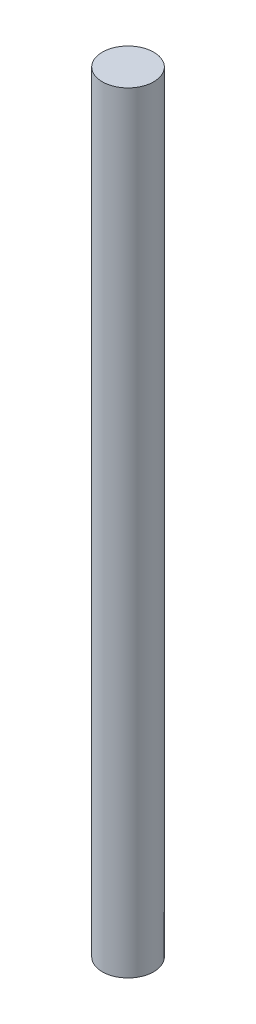
ISO-10303-21;
HEADER;
FILE_DESCRIPTION(('STEP AP214'),'2;1');
FILE_NAME('part.step','',(''),(''),'','','');
FILE_SCHEMA(('AUTOMOTIVE_DESIGN { 1 0 10303 214 1 1 1 1 }'));
ENDSEC;
DATA;
#1=APPLICATION_CONTEXT('core data for automotive mechanical design processes');
#2=APPLICATION_PROTOCOL_DEFINITION('international standard','automotive_design',2000,#1);
#3=PRODUCT_CONTEXT('',#1,'mechanical');
#4=PRODUCT('Part','Part','',(#3));
#5=PRODUCT_RELATED_PRODUCT_CATEGORY('part','',(#4));
#6=PRODUCT_DEFINITION_FORMATION('','',#4);
#7=PRODUCT_DEFINITION_CONTEXT('part definition',#1,'design');
#8=PRODUCT_DEFINITION('design','',#6,#7);
#9=PRODUCT_DEFINITION_SHAPE('','',#8);
#10=(LENGTH_UNIT() NAMED_UNIT(*) SI_UNIT(.MILLI.,.METRE.));
#11=(NAMED_UNIT(*) PLANE_ANGLE_UNIT() SI_UNIT($,.RADIAN.));
#12=(NAMED_UNIT(*) SI_UNIT($,.STERADIAN.) SOLID_ANGLE_UNIT());
#13=UNCERTAINTY_MEASURE_WITH_UNIT(LENGTH_MEASURE(1.E-05),#10,'distance_accuracy_value','');
#14=(GEOMETRIC_REPRESENTATION_CONTEXT(3) GLOBAL_UNCERTAINTY_ASSIGNED_CONTEXT((#13)) GLOBAL_UNIT_ASSIGNED_CONTEXT((#10,
#11,#12)) REPRESENTATION_CONTEXT('',''));
#15=CARTESIAN_POINT('',(0.,0.,0.));
#16=DIRECTION('',(0.,0.,1.));
#17=DIRECTION('',(1.,0.,0.));
#18=AXIS2_PLACEMENT_3D('',#15,#16,#17);
#19=CARTESIAN_POINT('',(0.,22.5,0.));
#20=DIRECTION('',(0.,-1.,0.));
#21=DIRECTION('',(0.,0.,-1.));
#22=AXIS2_PLACEMENT_3D('',#19,#20,#21);
#23=CYLINDRICAL_SURFACE('',#22,1.5);
#24=CARTESIAN_POINT('',(0.,22.5,0.));
#25=DIRECTION('',(0.,1.,0.));
#26=DIRECTION('',(0.,0.,1.));
#27=AXIS2_PLACEMENT_3D('',#24,#25,#26);
#28=CIRCLE('',#27,1.5);
#29=CARTESIAN_POINT('',(0.,22.5,-1.5));
#30=VERTEX_POINT('',#29);
#31=EDGE_CURVE('E10',#30,#30,#28,.T.);
#32=CARTESIAN_POINT('',(0.,-22.5,0.));
#33=DIRECTION('',(0.,1.,0.));
#34=DIRECTION('',(0.,0.,1.));
#35=AXIS2_PLACEMENT_3D('',#32,#33,#34);
#36=CIRCLE('',#35,1.5);
#37=CARTESIAN_POINT('',(0.,-22.5,-1.5));
#38=VERTEX_POINT('',#37);
#39=EDGE_CURVE('E33',#38,#38,#36,.T.);
#40=CARTESIAN_POINT('',(0.,22.5,-1.5));
#41=CARTESIAN_POINT('',(0.,22.03125,-1.5));
#42=CARTESIAN_POINT('',(0.,21.5625,-1.5));
#43=CARTESIAN_POINT('',(0.,20.625,-1.5));
#44=CARTESIAN_POINT('',(0.,20.15625,-1.5));
#45=CARTESIAN_POINT('',(0.,19.21875,-1.5));
#46=CARTESIAN_POINT('',(0.,18.75,-1.5));
#47=CARTESIAN_POINT('',(0.,17.8125,-1.5));
#48=CARTESIAN_POINT('',(0.,17.34375,-1.5));
#49=CARTESIAN_POINT('',(0.,16.40625,-1.5));
#50=CARTESIAN_POINT('',(0.,15.9375,-1.5));
#51=CARTESIAN_POINT('',(0.,15.,-1.5));
#52=CARTESIAN_POINT('',(0.,14.53125,-1.5));
#53=CARTESIAN_POINT('',(0.,13.59375,-1.5));
#54=CARTESIAN_POINT('',(0.,13.125,-1.5));
#55=CARTESIAN_POINT('',(0.,12.1875,-1.5));
#56=CARTESIAN_POINT('',(0.,11.71875,-1.5));
#57=CARTESIAN_POINT('',(0.,10.78125,-1.5));
#58=CARTESIAN_POINT('',(0.,10.3125,-1.5));
#59=CARTESIAN_POINT('',(0.,9.37499999999999,-1.5));
#60=CARTESIAN_POINT('',(0.,8.90625,-1.5));
#61=CARTESIAN_POINT('',(0.,7.96874999999999,-1.5));
#62=CARTESIAN_POINT('',(0.,7.5,-1.5));
#63=CARTESIAN_POINT('',(0.,6.5625,-1.5));
#64=CARTESIAN_POINT('',(0.,6.09374999999999,-1.5));
#65=CARTESIAN_POINT('',(0.,5.15624999999999,-1.5));
#66=CARTESIAN_POINT('',(0.,4.68749999999999,-1.5));
#67=CARTESIAN_POINT('',(0.,3.74999999999999,-1.5));
#68=CARTESIAN_POINT('',(0.,3.28124999999999,-1.5));
#69=CARTESIAN_POINT('',(0.,2.34375,-1.5));
#70=CARTESIAN_POINT('',(0.,1.87499999999999,-1.5));
#71=CARTESIAN_POINT('',(0.,0.937499999999994,-1.5));
#72=CARTESIAN_POINT('',(0.,0.468749999999993,-1.5));
#73=CARTESIAN_POINT('',(0.,-0.468750000000007,-1.5));
#74=CARTESIAN_POINT('',(0.,-0.937500000000008,-1.5));
#75=CARTESIAN_POINT('',(0.,-1.87500000000001,-1.5));
#76=CARTESIAN_POINT('',(0.,-2.34375000000001,-1.5));
#77=CARTESIAN_POINT('',(0.,-3.28125000000001,-1.5));
#78=CARTESIAN_POINT('',(0.,-3.75000000000001,-1.5));
#79=CARTESIAN_POINT('',(0.,-4.68750000000001,-1.5));
#80=CARTESIAN_POINT('',(0.,-5.15625000000001,-1.5));
#81=CARTESIAN_POINT('',(0.,-6.09375000000001,-1.5));
#82=CARTESIAN_POINT('',(0.,-6.56250000000001,-1.5));
#83=CARTESIAN_POINT('',(0.,-7.50000000000001,-1.5));
#84=CARTESIAN_POINT('',(0.,-7.96875000000001,-1.5));
#85=CARTESIAN_POINT('',(0.,-8.90625000000001,-1.5));
#86=CARTESIAN_POINT('',(0.,-9.37500000000001,-1.5));
#87=CARTESIAN_POINT('',(0.,-10.3125,-1.5));
#88=CARTESIAN_POINT('',(0.,-10.78125,-1.5));
#89=CARTESIAN_POINT('',(0.,-11.71875,-1.5));
#90=CARTESIAN_POINT('',(0.,-12.1875,-1.5));
#91=CARTESIAN_POINT('',(0.,-13.125,-1.5));
#92=CARTESIAN_POINT('',(0.,-13.59375,-1.5));
#93=CARTESIAN_POINT('',(0.,-14.53125,-1.5));
#94=CARTESIAN_POINT('',(0.,-15.,-1.5));
#95=CARTESIAN_POINT('',(0.,-15.9375,-1.5));
#96=CARTESIAN_POINT('',(0.,-16.40625,-1.5));
#97=CARTESIAN_POINT('',(0.,-17.34375,-1.5));
#98=CARTESIAN_POINT('',(0.,-17.8125,-1.5));
#99=CARTESIAN_POINT('',(0.,-18.75,-1.5));
#100=CARTESIAN_POINT('',(0.,-19.21875,-1.5));
#101=CARTESIAN_POINT('',(0.,-20.15625,-1.5));
#102=CARTESIAN_POINT('',(0.,-20.625,-1.5));
#103=CARTESIAN_POINT('',(0.,-21.5625,-1.5));
#104=CARTESIAN_POINT('',(0.,-22.03125,-1.5));
#105=CARTESIAN_POINT('',(0.,-22.5,-1.5));
#106=B_SPLINE_CURVE_WITH_KNOTS('',3,(#40,#41,#42,#43,#44,#45,#46,#47,#48,#49,#50,#51,#52,#53,
#54,#55,#56,#57,#58,#59,#60,#61,#62,#63,#64,#65,#66,#67,#68,#69,#70,#71,#72,#73,#74,#75,#76,#77,
#78,#79,#80,#81,#82,#83,#84,#85,#86,#87,#88,#89,#90,#91,#92,#93,#94,#95,#96,#97,#98,#99,#100,
#101,#102,#103,#104,#105),.UNSPECIFIED.,.F.,.F.,(4,2,2,2,2,2,2,2,2,2,2,2,2,2,2,2,2,2,2,2,2,2,2,
2,2,2,2,2,2,2,2,2,4),(0.,1.40625,2.8125,4.21875,5.625,7.03125,8.4375,9.84375,11.25,12.65625,
14.0625,15.46875,16.875,18.28125,19.6875,21.09375,22.5,23.90625,25.3125,26.71875,28.125,
29.53125,30.9375,32.34375,33.75,35.15625,36.5625,37.96875,39.375,40.78125,42.1875,43.59375,45.),.UNSPECIFIED.);
#107=EDGE_CURVE('BSEAM30',#30,#38,#106,.T.);
#108=ORIENTED_EDGE('',*,*,#31,.F.);
#109=ORIENTED_EDGE('',*,*,#39,.T.);
#110=ORIENTED_EDGE('',*,*,#107,.T.);
#111=ORIENTED_EDGE('',*,*,#107,.F.);
#112=EDGE_LOOP('',(#108,#110,#109,#111));
#113=FACE_BOUND('',#112,.T.);
#114=ADVANCED_FACE('F30',(#113),#23,.T.);
#115=CARTESIAN_POINT('',(0.,22.5,0.));
#116=DIRECTION('',(0.,1.,0.));
#117=DIRECTION('',(0.,0.,1.));
#118=AXIS2_PLACEMENT_3D('',#115,#116,#117);
#119=PLANE('',#118);
#120=ORIENTED_EDGE('',*,*,#31,.T.);
#121=EDGE_LOOP('',(#120));
#122=FACE_BOUND('',#121,.T.);
#123=ADVANCED_FACE('F45',(#122),#119,.T.);
#124=CARTESIAN_POINT('',(0.,-22.5,0.));
#125=DIRECTION('',(0.,1.,0.));
#126=DIRECTION('',(0.,0.,1.));
#127=AXIS2_PLACEMENT_3D('',#124,#125,#126);
#128=PLANE('',#127);
#129=ORIENTED_EDGE('',*,*,#39,.F.);
#130=EDGE_LOOP('',(#129));
#131=FACE_BOUND('',#130,.T.);
#132=ADVANCED_FACE('F43',(#131),#128,.F.);
#133=CLOSED_SHELL('',(#114,#123,#132));
#134=MANIFOLD_SOLID_BREP('B2',#133);
#135=ADVANCED_BREP_SHAPE_REPRESENTATION('',(#18,#134),#14);
#136=SHAPE_DEFINITION_REPRESENTATION(#9,#135);
ENDSEC;
END-ISO-10303-21;
